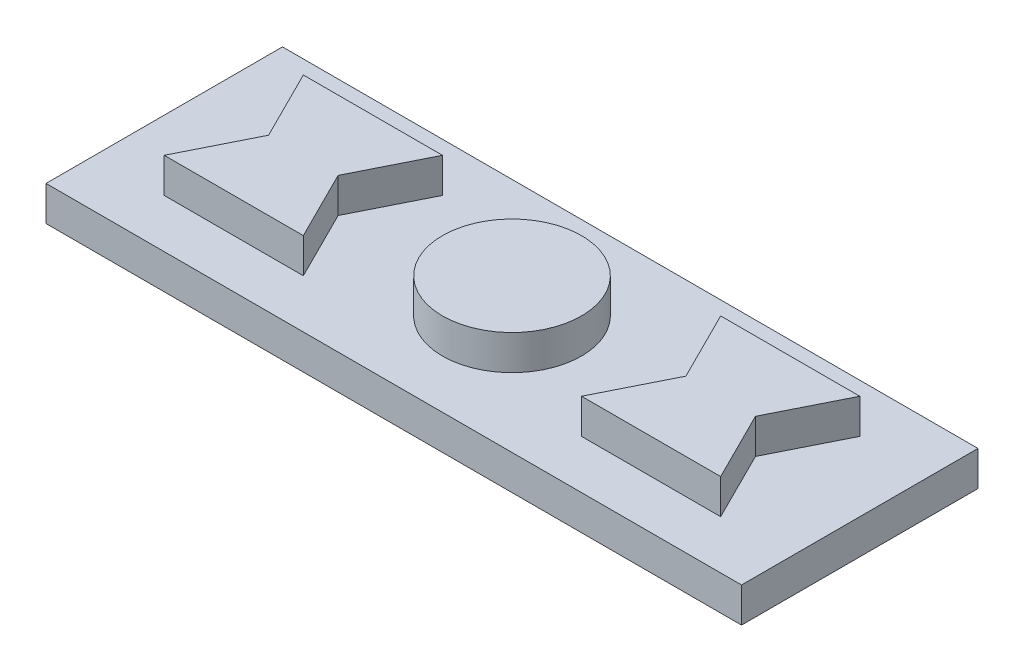
ISO-10303-21;
HEADER;
FILE_DESCRIPTION(('STEP AP214'),'2;1');
FILE_NAME('part.step','',(''),(''),'','','');
FILE_SCHEMA(('AUTOMOTIVE_DESIGN { 1 0 10303 214 1 1 1 1 }'));
ENDSEC;
DATA;
#1=APPLICATION_CONTEXT('core data for automotive mechanical design processes');
#2=APPLICATION_PROTOCOL_DEFINITION('international standard','automotive_design',2000,#1);
#3=PRODUCT_CONTEXT('',#1,'mechanical');
#4=PRODUCT('Part','Part','',(#3));
#5=PRODUCT_RELATED_PRODUCT_CATEGORY('part','',(#4));
#6=PRODUCT_DEFINITION_FORMATION('','',#4);
#7=PRODUCT_DEFINITION_CONTEXT('part definition',#1,'design');
#8=PRODUCT_DEFINITION('design','',#6,#7);
#9=PRODUCT_DEFINITION_SHAPE('','',#8);
#10=(LENGTH_UNIT() NAMED_UNIT(*) SI_UNIT(.MILLI.,.METRE.));
#11=(NAMED_UNIT(*) PLANE_ANGLE_UNIT() SI_UNIT($,.RADIAN.));
#12=(NAMED_UNIT(*) SI_UNIT($,.STERADIAN.) SOLID_ANGLE_UNIT());
#13=UNCERTAINTY_MEASURE_WITH_UNIT(LENGTH_MEASURE(1.E-05),#10,'distance_accuracy_value','');
#14=(GEOMETRIC_REPRESENTATION_CONTEXT(3) GLOBAL_UNCERTAINTY_ASSIGNED_CONTEXT((#13)) GLOBAL_UNIT_ASSIGNED_CONTEXT((#10,
#11,#12)) REPRESENTATION_CONTEXT('',''));
#15=CARTESIAN_POINT('',(0.,0.,0.));
#16=DIRECTION('',(0.,0.,1.));
#17=DIRECTION('',(1.,0.,0.));
#18=AXIS2_PLACEMENT_3D('',#15,#16,#17);
#19=CARTESIAN_POINT('',(0.,5.,0.));
#20=DIRECTION('',(0.,1.,0.));
#21=DIRECTION('',(0.,0.,1.));
#22=AXIS2_PLACEMENT_3D('',#19,#20,#21);
#23=PLANE('',#22);
#24=DIRECTION('',(0.,0.,-1.));
#25=VECTOR('',#24,1.);
#26=CARTESIAN_POINT('',(50.,5.,-17.));
#27=LINE('',#26,#25);
#28=CARTESIAN_POINT('',(50.,5.,17.));
#29=VERTEX_POINT('',#28);
#30=CARTESIAN_POINT('',(50.,5.,-17.));
#31=VERTEX_POINT('',#30);
#32=EDGE_CURVE('E308',#29,#31,#27,.T.);
#33=ORIENTED_EDGE('',*,*,#32,.T.);
#34=DIRECTION('',(-1.,0.,0.));
#35=VECTOR('',#34,1.);
#36=CARTESIAN_POINT('',(-50.,5.,-17.));
#37=LINE('',#36,#35);
#38=CARTESIAN_POINT('',(-50.,5.,-17.));
#39=VERTEX_POINT('',#38);
#40=EDGE_CURVE('E312',#31,#39,#37,.T.);
#41=ORIENTED_EDGE('',*,*,#40,.T.);
#42=DIRECTION('',(0.,0.,1.));
#43=VECTOR('',#42,1.);
#44=CARTESIAN_POINT('',(-50.,5.,-17.));
#45=LINE('',#44,#43);
#46=CARTESIAN_POINT('',(-50.,5.,17.));
#47=VERTEX_POINT('',#46);
#48=EDGE_CURVE('E316',#39,#47,#45,.T.);
#49=ORIENTED_EDGE('',*,*,#48,.T.);
#50=DIRECTION('',(1.,0.,0.));
#51=VECTOR('',#50,1.);
#52=CARTESIAN_POINT('',(-50.,5.,17.));
#53=LINE('',#52,#51);
#54=EDGE_CURVE('E319',#47,#29,#53,.T.);
#55=ORIENTED_EDGE('',*,*,#54,.T.);
#56=EDGE_LOOP('',(#33,#41,#49,#55));
#57=FACE_BOUND('',#56,.T.);
#58=CARTESIAN_POINT('',(0.,5.,0.));
#59=DIRECTION('',(0.,1.,0.));
#60=DIRECTION('',(0.,0.,1.));
#61=AXIS2_PLACEMENT_3D('',#58,#59,#60);
#62=CIRCLE('',#61,10.);
#63=CARTESIAN_POINT('',(0.,5.,10.));
#64=VERTEX_POINT('',#63);
#65=EDGE_CURVE('E303',#64,#64,#62,.T.);
#66=ORIENTED_EDGE('',*,*,#65,.F.);
#67=EDGE_LOOP('',(#66));
#68=FACE_BOUND('',#67,.T.);
#69=DIRECTION('',(-0.447213595499956,0.,0.894427190999917));
#70=VECTOR('',#69,1.);
#71=CARTESIAN_POINT('',(-40.,5.,10.));
#72=LINE('',#71,#70);
#73=CARTESIAN_POINT('',(-35.,5.,0.));
#74=VERTEX_POINT('',#73);
#75=CARTESIAN_POINT('',(-40.,5.,10.));
#76=VERTEX_POINT('',#75);
#77=EDGE_CURVE('E286',#74,#76,#72,.T.);
#78=ORIENTED_EDGE('',*,*,#77,.F.);
#79=DIRECTION('',(0.447213595499958,0.,0.894427190999916));
#80=VECTOR('',#79,1.);
#81=CARTESIAN_POINT('',(-40.,5.,-9.99999999999999));
#82=LINE('',#81,#80);
#83=CARTESIAN_POINT('',(-40.,5.,-9.99999999999999));
#84=VERTEX_POINT('',#83);
#85=EDGE_CURVE('E282',#84,#74,#82,.T.);
#86=ORIENTED_EDGE('',*,*,#85,.F.);
#87=DIRECTION('',(-1.,0.,0.));
#88=VECTOR('',#87,1.);
#89=CARTESIAN_POINT('',(-40.,5.,-9.99999999999999));
#90=LINE('',#89,#88);
#91=CARTESIAN_POINT('',(-20.,5.,-10.));
#92=VERTEX_POINT('',#91);
#93=EDGE_CURVE('E67',#92,#84,#90,.T.);
#94=ORIENTED_EDGE('',*,*,#93,.F.);
#95=DIRECTION('',(0.447213595499958,0.,-0.894427190999916));
#96=VECTOR('',#95,1.);
#97=CARTESIAN_POINT('',(-20.,5.,-10.));
#98=LINE('',#97,#96);
#99=CARTESIAN_POINT('',(-25.,5.,0.));
#100=VERTEX_POINT('',#99);
#101=EDGE_CURVE('E298',#100,#92,#98,.T.);
#102=ORIENTED_EDGE('',*,*,#101,.F.);
#103=DIRECTION('',(-0.447213595499959,0.,-0.894427190999915));
#104=VECTOR('',#103,1.);
#105=CARTESIAN_POINT('',(-20.,5.,10.));
#106=LINE('',#105,#104);
#107=CARTESIAN_POINT('',(-20.,5.,10.));
#108=VERTEX_POINT('',#107);
#109=EDGE_CURVE('E294',#108,#100,#106,.T.);
#110=ORIENTED_EDGE('',*,*,#109,.F.);
#111=DIRECTION('',(1.,0.,0.));
#112=VECTOR('',#111,1.);
#113=CARTESIAN_POINT('',(-40.,5.,10.));
#114=LINE('',#113,#112);
#115=EDGE_CURVE('E290',#76,#108,#114,.T.);
#116=ORIENTED_EDGE('',*,*,#115,.F.);
#117=EDGE_LOOP('',(#78,#86,#94,#102,#110,#116));
#118=FACE_BOUND('',#117,.T.);
#119=DIRECTION('',(-1.,0.,0.));
#120=VECTOR('',#119,1.);
#121=CARTESIAN_POINT('',(40.,5.,-10.));
#122=LINE('',#121,#120);
#123=CARTESIAN_POINT('',(40.,5.,-10.));
#124=VERTEX_POINT('',#123);
#125=CARTESIAN_POINT('',(20.,5.,-10.));
#126=VERTEX_POINT('',#125);
#127=EDGE_CURVE('E266',#124,#126,#122,.T.);
#128=ORIENTED_EDGE('',*,*,#127,.F.);
#129=DIRECTION('',(0.447213595499957,0.,-0.894427190999916));
#130=VECTOR('',#129,1.);
#131=CARTESIAN_POINT('',(40.,5.,-10.));
#132=LINE('',#131,#130);
#133=CARTESIAN_POINT('',(35.,5.,0.));
#134=VERTEX_POINT('',#133);
#135=EDGE_CURVE('E262',#134,#124,#132,.T.);
#136=ORIENTED_EDGE('',*,*,#135,.F.);
#137=DIRECTION('',(-0.447213595499957,0.,-0.894427190999916));
#138=VECTOR('',#137,1.);
#139=CARTESIAN_POINT('',(40.,5.,9.99999999999998));
#140=LINE('',#139,#138);
#141=CARTESIAN_POINT('',(40.,5.,9.99999999999997));
#142=VERTEX_POINT('',#141);
#143=EDGE_CURVE('E59',#142,#134,#140,.T.);
#144=ORIENTED_EDGE('',*,*,#143,.F.);
#145=DIRECTION('',(1.,0.,0.));
#146=VECTOR('',#145,1.);
#147=CARTESIAN_POINT('',(40.,5.,9.99999999999998));
#148=LINE('',#147,#146);
#149=CARTESIAN_POINT('',(20.,5.,9.99999999999999));
#150=VERTEX_POINT('',#149);
#151=EDGE_CURVE('E164',#150,#142,#148,.T.);
#152=ORIENTED_EDGE('',*,*,#151,.F.);
#153=DIRECTION('',(-0.447213595499958,0.,0.894427190999916));
#154=VECTOR('',#153,1.);
#155=CARTESIAN_POINT('',(20.,5.,9.99999999999999));
#156=LINE('',#155,#154);
#157=CARTESIAN_POINT('',(25.,5.,0.));
#158=VERTEX_POINT('',#157);
#159=EDGE_CURVE('E274',#158,#150,#156,.T.);
#160=ORIENTED_EDGE('',*,*,#159,.F.);
#161=DIRECTION('',(0.447213595499959,0.,0.894427190999916));
#162=VECTOR('',#161,1.);
#163=CARTESIAN_POINT('',(20.,5.,-10.));
#164=LINE('',#163,#162);
#165=EDGE_CURVE('E270',#126,#158,#164,.T.);
#166=ORIENTED_EDGE('',*,*,#165,.F.);
#167=EDGE_LOOP('',(#128,#136,#144,#152,#160,#166));
#168=FACE_BOUND('',#167,.T.);
#169=ADVANCED_FACE('F43',(#57,#68,#118,#168),#23,.T.);
#170=CARTESIAN_POINT('',(0.,0.,0.));
#171=DIRECTION('',(0.,1.,0.));
#172=DIRECTION('',(0.,0.,1.));
#173=AXIS2_PLACEMENT_3D('',#170,#171,#172);
#174=PLANE('',#173);
#175=DIRECTION('',(0.,0.,-1.));
#176=VECTOR('',#175,1.);
#177=CARTESIAN_POINT('',(50.,0.,-17.));
#178=LINE('',#177,#176);
#179=CARTESIAN_POINT('',(50.,0.,17.));
#180=VERTEX_POINT('',#179);
#181=CARTESIAN_POINT('',(50.,0.,-17.));
#182=VERTEX_POINT('',#181);
#183=EDGE_CURVE('E307',#180,#182,#178,.T.);
#184=ORIENTED_EDGE('',*,*,#183,.F.);
#185=DIRECTION('',(1.,0.,0.));
#186=VECTOR('',#185,1.);
#187=CARTESIAN_POINT('',(-50.,0.,17.));
#188=LINE('',#187,#186);
#189=CARTESIAN_POINT('',(-50.,0.,17.));
#190=VERTEX_POINT('',#189);
#191=EDGE_CURVE('E313',#190,#180,#188,.T.);
#192=ORIENTED_EDGE('',*,*,#191,.F.);
#193=DIRECTION('',(0.,0.,1.));
#194=VECTOR('',#193,1.);
#195=CARTESIAN_POINT('',(-50.,0.,-17.));
#196=LINE('',#195,#194);
#197=CARTESIAN_POINT('',(-50.,0.,-17.));
#198=VERTEX_POINT('',#197);
#199=EDGE_CURVE('E329',#198,#190,#196,.T.);
#200=ORIENTED_EDGE('',*,*,#199,.F.);
#201=DIRECTION('',(-1.,0.,0.));
#202=VECTOR('',#201,1.);
#203=CARTESIAN_POINT('',(-50.,0.,-17.));
#204=LINE('',#203,#202);
#205=EDGE_CURVE('E326',#182,#198,#204,.T.);
#206=ORIENTED_EDGE('',*,*,#205,.F.);
#207=EDGE_LOOP('',(#184,#192,#200,#206));
#208=FACE_BOUND('',#207,.T.);
#209=ADVANCED_FACE('F352',(#208),#174,.F.);
#210=CARTESIAN_POINT('',(50.,5.,-17.));
#211=DIRECTION('',(-1.,0.,0.));
#212=DIRECTION('',(0.,0.,1.));
#213=AXIS2_PLACEMENT_3D('',#210,#211,#212);
#214=PLANE('',#213);
#215=ORIENTED_EDGE('',*,*,#183,.T.);
#216=DIRECTION('',(0.,-1.,0.));
#217=VECTOR('',#216,1.);
#218=CARTESIAN_POINT('',(50.,5.,-17.));
#219=LINE('',#218,#217);
#220=EDGE_CURVE('E11',#31,#182,#219,.T.);
#221=ORIENTED_EDGE('',*,*,#220,.F.);
#222=ORIENTED_EDGE('',*,*,#32,.F.);
#223=DIRECTION('',(0.,-1.,0.));
#224=VECTOR('',#223,1.);
#225=CARTESIAN_POINT('',(50.,5.,17.));
#226=LINE('',#225,#224);
#227=EDGE_CURVE('E322',#29,#180,#226,.T.);
#228=ORIENTED_EDGE('',*,*,#227,.T.);
#229=EDGE_LOOP('',(#215,#221,#222,#228));
#230=FACE_BOUND('',#229,.T.);
#231=ADVANCED_FACE('F45',(#230),#214,.F.);
#232=CARTESIAN_POINT('',(-50.,5.,-17.));
#233=DIRECTION('',(0.,0.,1.));
#234=DIRECTION('',(1.,0.,0.));
#235=AXIS2_PLACEMENT_3D('',#232,#233,#234);
#236=PLANE('',#235);
#237=ORIENTED_EDGE('',*,*,#205,.T.);
#238=DIRECTION('',(0.,-1.,0.));
#239=VECTOR('',#238,1.);
#240=CARTESIAN_POINT('',(-50.,5.,-17.));
#241=LINE('',#240,#239);
#242=EDGE_CURVE('E52',#39,#198,#241,.T.);
#243=ORIENTED_EDGE('',*,*,#242,.F.);
#244=ORIENTED_EDGE('',*,*,#40,.F.);
#245=ORIENTED_EDGE('',*,*,#220,.T.);
#246=EDGE_LOOP('',(#237,#243,#244,#245));
#247=FACE_BOUND('',#246,.T.);
#248=ADVANCED_FACE('F362',(#247),#236,.F.);
#249=CARTESIAN_POINT('',(-50.,5.,-17.));
#250=DIRECTION('',(1.,0.,0.));
#251=DIRECTION('',(0.,0.,-1.));
#252=AXIS2_PLACEMENT_3D('',#249,#250,#251);
#253=PLANE('',#252);
#254=ORIENTED_EDGE('',*,*,#199,.T.);
#255=DIRECTION('',(0.,-1.,0.));
#256=VECTOR('',#255,1.);
#257=CARTESIAN_POINT('',(-50.,5.,17.));
#258=LINE('',#257,#256);
#259=EDGE_CURVE('E337',#47,#190,#258,.T.);
#260=ORIENTED_EDGE('',*,*,#259,.F.);
#261=ORIENTED_EDGE('',*,*,#48,.F.);
#262=ORIENTED_EDGE('',*,*,#242,.T.);
#263=EDGE_LOOP('',(#254,#260,#261,#262));
#264=FACE_BOUND('',#263,.T.);
#265=ADVANCED_FACE('F346',(#264),#253,.F.);
#266=CARTESIAN_POINT('',(-50.,5.,17.));
#267=DIRECTION('',(0.,0.,-1.));
#268=DIRECTION('',(-1.,0.,0.));
#269=AXIS2_PLACEMENT_3D('',#266,#267,#268);
#270=PLANE('',#269);
#271=ORIENTED_EDGE('',*,*,#191,.T.);
#272=ORIENTED_EDGE('',*,*,#227,.F.);
#273=ORIENTED_EDGE('',*,*,#54,.F.);
#274=ORIENTED_EDGE('',*,*,#259,.T.);
#275=EDGE_LOOP('',(#271,#272,#273,#274));
#276=FACE_BOUND('',#275,.T.);
#277=ADVANCED_FACE('F355',(#276),#270,.F.);
#278=CARTESIAN_POINT('',(0.,10.,10.));
#279=DIRECTION('',(0.,0.,-1.));
#280=DIRECTION('',(-1.,0.,0.));
#281=AXIS2_PLACEMENT_3D('',#278,#279,#280);
#282=PLANE('',#281);
#283=ORIENTED_EDGE('',*,*,#115,.T.);
#284=DIRECTION('',(0.,-1.,0.));
#285=VECTOR('',#284,1.);
#286=CARTESIAN_POINT('',(-20.,10.,10.));
#287=LINE('',#286,#285);
#288=CARTESIAN_POINT('',(-20.,10.,10.));
#289=VERTEX_POINT('',#288);
#290=EDGE_CURVE('E258',#289,#108,#287,.T.);
#291=ORIENTED_EDGE('',*,*,#290,.F.);
#292=DIRECTION('',(1.,0.,0.));
#293=VECTOR('',#292,1.);
#294=CARTESIAN_POINT('',(0.,10.,10.));
#295=LINE('',#294,#293);
#296=CARTESIAN_POINT('',(-40.,10.,10.));
#297=VERTEX_POINT('',#296);
#298=EDGE_CURVE('E216',#297,#289,#295,.T.);
#299=ORIENTED_EDGE('',*,*,#298,.F.);
#300=DIRECTION('',(0.,-1.,0.));
#301=VECTOR('',#300,1.);
#302=CARTESIAN_POINT('',(-40.,10.,10.));
#303=LINE('',#302,#301);
#304=EDGE_CURVE('E238',#297,#76,#303,.T.);
#305=ORIENTED_EDGE('',*,*,#304,.T.);
#306=EDGE_LOOP('',(#283,#291,#299,#305));
#307=FACE_BOUND('',#306,.T.);
#308=ADVANCED_FACE('F376',(#307),#282,.F.);
#309=CARTESIAN_POINT('',(-20.,10.,10.));
#310=DIRECTION('',(-0.894427190999915,0.,0.447213595499959));
#311=DIRECTION('',(0.447213595499959,0.,0.894427190999915));
#312=AXIS2_PLACEMENT_3D('',#309,#310,#311);
#313=PLANE('',#312);
#314=ORIENTED_EDGE('',*,*,#109,.T.);
#315=DIRECTION('',(0.,-1.,0.));
#316=VECTOR('',#315,1.);
#317=CARTESIAN_POINT('',(-25.,10.,0.));
#318=LINE('',#317,#316);
#319=CARTESIAN_POINT('',(-25.,10.,0.));
#320=VERTEX_POINT('',#319);
#321=EDGE_CURVE('E254',#320,#100,#318,.T.);
#322=ORIENTED_EDGE('',*,*,#321,.F.);
#323=DIRECTION('',(-0.447213595499959,0.,-0.894427190999915));
#324=VECTOR('',#323,1.);
#325=CARTESIAN_POINT('',(-20.,10.,10.));
#326=LINE('',#325,#324);
#327=EDGE_CURVE('E220',#289,#320,#326,.T.);
#328=ORIENTED_EDGE('',*,*,#327,.F.);
#329=ORIENTED_EDGE('',*,*,#290,.T.);
#330=EDGE_LOOP('',(#314,#322,#328,#329));
#331=FACE_BOUND('',#330,.T.);
#332=ADVANCED_FACE('F383',(#331),#313,.F.);
#333=CARTESIAN_POINT('',(-20.,10.,-10.));
#334=DIRECTION('',(0.894427190999916,0.,0.447213595499958));
#335=DIRECTION('',(0.447213595499958,0.,-0.894427190999916));
#336=AXIS2_PLACEMENT_3D('',#333,#334,#335);
#337=PLANE('',#336);
#338=ORIENTED_EDGE('',*,*,#321,.T.);
#339=ORIENTED_EDGE('',*,*,#101,.T.);
#340=DIRECTION('',(0.,-1.,0.));
#341=VECTOR('',#340,1.);
#342=CARTESIAN_POINT('',(-20.,10.,-10.));
#343=LINE('',#342,#341);
#344=CARTESIAN_POINT('',(-20.,10.,-10.));
#345=VERTEX_POINT('',#344);
#346=EDGE_CURVE('E250',#345,#92,#343,.T.);
#347=ORIENTED_EDGE('',*,*,#346,.F.);
#348=DIRECTION('',(-0.447213595499958,0.,0.894427190999916));
#349=VECTOR('',#348,1.);
#350=CARTESIAN_POINT('',(-20.,10.,-10.));
#351=LINE('',#350,#349);
#352=EDGE_CURVE('E223',#345,#320,#351,.T.);
#353=ORIENTED_EDGE('',*,*,#352,.T.);
#354=EDGE_LOOP('',(#338,#339,#347,#353));
#355=FACE_BOUND('',#354,.T.);
#356=ADVANCED_FACE('F388',(#355),#337,.T.);
#357=CARTESIAN_POINT('',(0.,10.,-10.));
#358=DIRECTION('',(0.,0.,-1.));
#359=DIRECTION('',(-1.,0.,0.));
#360=AXIS2_PLACEMENT_3D('',#357,#358,#359);
#361=PLANE('',#360);
#362=ORIENTED_EDGE('',*,*,#346,.T.);
#363=ORIENTED_EDGE('',*,*,#93,.T.);
#364=DIRECTION('',(0.,-1.,0.));
#365=VECTOR('',#364,1.);
#366=CARTESIAN_POINT('',(-40.,10.,-9.99999999999999));
#367=LINE('',#366,#365);
#368=CARTESIAN_POINT('',(-40.,10.,-9.99999999999999));
#369=VERTEX_POINT('',#368);
#370=EDGE_CURVE('E246',#369,#84,#367,.T.);
#371=ORIENTED_EDGE('',*,*,#370,.F.);
#372=DIRECTION('',(1.,0.,0.));
#373=VECTOR('',#372,1.);
#374=CARTESIAN_POINT('',(0.,10.,-10.));
#375=LINE('',#374,#373);
#376=EDGE_CURVE('E227',#369,#345,#375,.T.);
#377=ORIENTED_EDGE('',*,*,#376,.T.);
#378=EDGE_LOOP('',(#362,#363,#371,#377));
#379=FACE_BOUND('',#378,.T.);
#380=ADVANCED_FACE('F405',(#379),#361,.T.);
#381=CARTESIAN_POINT('',(-28.,10.,14.));
#382=DIRECTION('',(0.894427190999916,0.,-0.447213595499958));
#383=DIRECTION('',(-0.447213595499958,0.,-0.894427190999916));
#384=AXIS2_PLACEMENT_3D('',#381,#382,#383);
#385=PLANE('',#384);
#386=ORIENTED_EDGE('',*,*,#85,.T.);
#387=DIRECTION('',(0.,-1.,0.));
#388=VECTOR('',#387,1.);
#389=CARTESIAN_POINT('',(-35.,10.,0.));
#390=LINE('',#389,#388);
#391=CARTESIAN_POINT('',(-35.,10.,0.));
#392=VERTEX_POINT('',#391);
#393=EDGE_CURVE('E242',#392,#74,#390,.T.);
#394=ORIENTED_EDGE('',*,*,#393,.F.);
#395=DIRECTION('',(0.447213595499958,0.,0.894427190999916));
#396=VECTOR('',#395,1.);
#397=CARTESIAN_POINT('',(-28.,10.,14.));
#398=LINE('',#397,#396);
#399=EDGE_CURVE('E231',#369,#392,#398,.T.);
#400=ORIENTED_EDGE('',*,*,#399,.F.);
#401=ORIENTED_EDGE('',*,*,#370,.T.);
#402=EDGE_LOOP('',(#386,#394,#400,#401));
#403=FACE_BOUND('',#402,.T.);
#404=ADVANCED_FACE('F403',(#403),#385,.F.);
#405=CARTESIAN_POINT('',(-28.0000000000001,10.,-14.));
#406=DIRECTION('',(-0.894427190999917,0.,-0.447213595499956));
#407=DIRECTION('',(-0.447213595499956,0.,0.894427190999917));
#408=AXIS2_PLACEMENT_3D('',#405,#406,#407);
#409=PLANE('',#408);
#410=ORIENTED_EDGE('',*,*,#393,.T.);
#411=ORIENTED_EDGE('',*,*,#77,.T.);
#412=ORIENTED_EDGE('',*,*,#304,.F.);
#413=DIRECTION('',(0.447213595499956,0.,-0.894427190999917));
#414=VECTOR('',#413,1.);
#415=CARTESIAN_POINT('',(-28.0000000000001,10.,-14.));
#416=LINE('',#415,#414);
#417=EDGE_CURVE('E234',#297,#392,#416,.T.);
#418=ORIENTED_EDGE('',*,*,#417,.T.);
#419=EDGE_LOOP('',(#410,#411,#412,#418));
#420=FACE_BOUND('',#419,.T.);
#421=ADVANCED_FACE('F401',(#420),#409,.T.);
#422=CARTESIAN_POINT('',(0.,10.,0.));
#423=DIRECTION('',(0.,1.,0.));
#424=DIRECTION('',(0.,0.,1.));
#425=AXIS2_PLACEMENT_3D('',#422,#423,#424);
#426=PLANE('',#425);
#427=ORIENTED_EDGE('',*,*,#298,.T.);
#428=ORIENTED_EDGE('',*,*,#327,.T.);
#429=ORIENTED_EDGE('',*,*,#352,.F.);
#430=ORIENTED_EDGE('',*,*,#376,.F.);
#431=ORIENTED_EDGE('',*,*,#399,.T.);
#432=ORIENTED_EDGE('',*,*,#417,.F.);
#433=EDGE_LOOP('',(#427,#428,#429,#430,#431,#432));
#434=FACE_BOUND('',#433,.T.);
#435=ADVANCED_FACE('F396',(#434),#426,.T.);
#436=CARTESIAN_POINT('',(0.,10.,0.));
#437=DIRECTION('',(0.,-1.,0.));
#438=DIRECTION('',(0.,0.,-1.));
#439=AXIS2_PLACEMENT_3D('',#436,#437,#438);
#440=CYLINDRICAL_SURFACE('',#439,10.);
#441=ORIENTED_EDGE('',*,*,#65,.T.);
#442=EDGE_LOOP('',(#441));
#443=FACE_BOUND('',#442,.T.);
#444=CARTESIAN_POINT('',(0.,10.,0.));
#445=DIRECTION('',(0.,1.,0.));
#446=DIRECTION('',(0.,0.,1.));
#447=AXIS2_PLACEMENT_3D('',#444,#445,#446);
#448=CIRCLE('',#447,10.);
#449=CARTESIAN_POINT('',(0.,10.,10.));
#450=VERTEX_POINT('',#449);
#451=EDGE_CURVE('E167',#450,#450,#448,.T.);
#452=ORIENTED_EDGE('',*,*,#451,.F.);
#453=EDGE_LOOP('',(#452));
#454=FACE_BOUND('',#453,.T.);
#455=ADVANCED_FACE('F420',(#443,#454),#440,.T.);
#456=CARTESIAN_POINT('',(0.,10.,0.));
#457=DIRECTION('',(0.,1.,0.));
#458=DIRECTION('',(0.,0.,1.));
#459=AXIS2_PLACEMENT_3D('',#456,#457,#458);
#460=PLANE('',#459);
#461=ORIENTED_EDGE('',*,*,#451,.T.);
#462=EDGE_LOOP('',(#461));
#463=FACE_BOUND('',#462,.T.);
#464=ADVANCED_FACE('F423',(#463),#460,.T.);
#465=CARTESIAN_POINT('',(0.,10.,10.));
#466=DIRECTION('',(0.,0.,1.));
#467=DIRECTION('',(1.,0.,0.));
#468=AXIS2_PLACEMENT_3D('',#465,#466,#467);
#469=PLANE('',#468);
#470=DIRECTION('',(0.,-1.,0.));
#471=VECTOR('',#470,1.);
#472=CARTESIAN_POINT('',(20.,10.,9.99999999999999));
#473=LINE('',#472,#471);
#474=CARTESIAN_POINT('',(20.,10.,9.99999999999999));
#475=VERTEX_POINT('',#474);
#476=EDGE_CURVE('E196',#475,#150,#473,.T.);
#477=ORIENTED_EDGE('',*,*,#476,.T.);
#478=ORIENTED_EDGE('',*,*,#151,.T.);
#479=DIRECTION('',(0.,-1.,0.));
#480=VECTOR('',#479,1.);
#481=CARTESIAN_POINT('',(40.,10.,9.99999999999998));
#482=LINE('',#481,#480);
#483=CARTESIAN_POINT('',(40.,10.,9.99999999999998));
#484=VERTEX_POINT('',#483);
#485=EDGE_CURVE('E157',#484,#142,#482,.T.);
#486=ORIENTED_EDGE('',*,*,#485,.F.);
#487=DIRECTION('',(-1.,0.,0.));
#488=VECTOR('',#487,1.);
#489=CARTESIAN_POINT('',(0.,10.,10.));
#490=LINE('',#489,#488);
#491=EDGE_CURVE('E162',#484,#475,#490,.T.);
#492=ORIENTED_EDGE('',*,*,#491,.T.);
#493=EDGE_LOOP('',(#477,#478,#486,#492));
#494=FACE_BOUND('',#493,.T.);
#495=ADVANCED_FACE('F160',(#494),#469,.T.);
#496=CARTESIAN_POINT('',(28.,10.,-14.));
#497=DIRECTION('',(-0.894427190999916,0.,0.447213595499957));
#498=DIRECTION('',(0.447213595499957,0.,0.894427190999916));
#499=AXIS2_PLACEMENT_3D('',#496,#497,#498);
#500=PLANE('',#499);
#501=ORIENTED_EDGE('',*,*,#143,.T.);
#502=DIRECTION('',(0.,-1.,0.));
#503=VECTOR('',#502,1.);
#504=CARTESIAN_POINT('',(35.,10.,0.));
#505=LINE('',#504,#503);
#506=CARTESIAN_POINT('',(35.,10.,0.));
#507=VERTEX_POINT('',#506);
#508=EDGE_CURVE('E168',#507,#134,#505,.T.);
#509=ORIENTED_EDGE('',*,*,#508,.F.);
#510=DIRECTION('',(-0.447213595499957,0.,-0.894427190999916));
#511=VECTOR('',#510,1.);
#512=CARTESIAN_POINT('',(28.,10.,-14.));
#513=LINE('',#512,#511);
#514=EDGE_CURVE('E171',#484,#507,#513,.T.);
#515=ORIENTED_EDGE('',*,*,#514,.F.);
#516=ORIENTED_EDGE('',*,*,#485,.T.);
#517=EDGE_LOOP('',(#501,#509,#515,#516));
#518=FACE_BOUND('',#517,.T.);
#519=ADVANCED_FACE('F172',(#518),#500,.F.);
#520=CARTESIAN_POINT('',(28.,10.,14.));
#521=DIRECTION('',(0.894427190999916,0.,0.447213595499957));
#522=DIRECTION('',(0.447213595499957,0.,-0.894427190999916));
#523=AXIS2_PLACEMENT_3D('',#520,#521,#522);
#524=PLANE('',#523);
#525=ORIENTED_EDGE('',*,*,#508,.T.);
#526=ORIENTED_EDGE('',*,*,#135,.T.);
#527=DIRECTION('',(0.,-1.,0.));
#528=VECTOR('',#527,1.);
#529=CARTESIAN_POINT('',(40.,10.,-10.));
#530=LINE('',#529,#528);
#531=CARTESIAN_POINT('',(40.,10.,-10.));
#532=VERTEX_POINT('',#531);
#533=EDGE_CURVE('E207',#532,#124,#530,.T.);
#534=ORIENTED_EDGE('',*,*,#533,.F.);
#535=DIRECTION('',(-0.447213595499957,0.,0.894427190999916));
#536=VECTOR('',#535,1.);
#537=CARTESIAN_POINT('',(28.,10.,14.));
#538=LINE('',#537,#536);
#539=EDGE_CURVE('E178',#532,#507,#538,.T.);
#540=ORIENTED_EDGE('',*,*,#539,.T.);
#541=EDGE_LOOP('',(#525,#526,#534,#540));
#542=FACE_BOUND('',#541,.T.);
#543=ADVANCED_FACE('F432',(#542),#524,.T.);
#544=CARTESIAN_POINT('',(0.,10.,-10.));
#545=DIRECTION('',(0.,0.,1.));
#546=DIRECTION('',(1.,0.,0.));
#547=AXIS2_PLACEMENT_3D('',#544,#545,#546);
#548=PLANE('',#547);
#549=ORIENTED_EDGE('',*,*,#127,.T.);
#550=DIRECTION('',(0.,-1.,0.));
#551=VECTOR('',#550,1.);
#552=CARTESIAN_POINT('',(20.,10.,-10.));
#553=LINE('',#552,#551);
#554=CARTESIAN_POINT('',(20.,10.,-10.));
#555=VERTEX_POINT('',#554);
#556=EDGE_CURVE('E203',#555,#126,#553,.T.);
#557=ORIENTED_EDGE('',*,*,#556,.F.);
#558=DIRECTION('',(-1.,0.,0.));
#559=VECTOR('',#558,1.);
#560=CARTESIAN_POINT('',(0.,10.,-10.));
#561=LINE('',#560,#559);
#562=EDGE_CURVE('E188',#532,#555,#561,.T.);
#563=ORIENTED_EDGE('',*,*,#562,.F.);
#564=ORIENTED_EDGE('',*,*,#533,.T.);
#565=EDGE_LOOP('',(#549,#557,#563,#564));
#566=FACE_BOUND('',#565,.T.);
#567=ADVANCED_FACE('F435',(#566),#548,.F.);
#568=CARTESIAN_POINT('',(20.,10.,-10.));
#569=DIRECTION('',(0.894427190999915,0.,-0.447213595499959));
#570=DIRECTION('',(-0.447213595499959,0.,-0.894427190999915));
#571=AXIS2_PLACEMENT_3D('',#568,#569,#570);
#572=PLANE('',#571);
#573=ORIENTED_EDGE('',*,*,#165,.T.);
#574=DIRECTION('',(0.,-1.,0.));
#575=VECTOR('',#574,1.);
#576=CARTESIAN_POINT('',(25.,10.,0.));
#577=LINE('',#576,#575);
#578=CARTESIAN_POINT('',(25.,10.,0.));
#579=VERTEX_POINT('',#578);
#580=EDGE_CURVE('E199',#579,#158,#577,.T.);
#581=ORIENTED_EDGE('',*,*,#580,.F.);
#582=DIRECTION('',(0.447213595499959,0.,0.894427190999915));
#583=VECTOR('',#582,1.);
#584=CARTESIAN_POINT('',(20.,10.,-10.));
#585=LINE('',#584,#583);
#586=EDGE_CURVE('E191',#555,#579,#585,.T.);
#587=ORIENTED_EDGE('',*,*,#586,.F.);
#588=ORIENTED_EDGE('',*,*,#556,.T.);
#589=EDGE_LOOP('',(#573,#581,#587,#588));
#590=FACE_BOUND('',#589,.T.);
#591=ADVANCED_FACE('F439',(#590),#572,.F.);
#592=CARTESIAN_POINT('',(20.,10.,10.));
#593=DIRECTION('',(-0.894427190999916,0.,-0.447213595499958));
#594=DIRECTION('',(-0.447213595499958,0.,0.894427190999916));
#595=AXIS2_PLACEMENT_3D('',#592,#593,#594);
#596=PLANE('',#595);
#597=ORIENTED_EDGE('',*,*,#580,.T.);
#598=ORIENTED_EDGE('',*,*,#159,.T.);
#599=ORIENTED_EDGE('',*,*,#476,.F.);
#600=DIRECTION('',(0.447213595499958,0.,-0.894427190999916));
#601=VECTOR('',#600,1.);
#602=CARTESIAN_POINT('',(20.,10.,10.));
#603=LINE('',#602,#601);
#604=EDGE_CURVE('E182',#475,#579,#603,.T.);
#605=ORIENTED_EDGE('',*,*,#604,.T.);
#606=EDGE_LOOP('',(#597,#598,#599,#605));
#607=FACE_BOUND('',#606,.T.);
#608=ADVANCED_FACE('F443',(#607),#596,.T.);
#609=CARTESIAN_POINT('',(0.,10.,0.));
#610=DIRECTION('',(0.,1.,0.));
#611=DIRECTION('',(0.,0.,1.));
#612=AXIS2_PLACEMENT_3D('',#609,#610,#611);
#613=PLANE('',#612);
#614=ORIENTED_EDGE('',*,*,#491,.F.);
#615=ORIENTED_EDGE('',*,*,#514,.T.);
#616=ORIENTED_EDGE('',*,*,#539,.F.);
#617=ORIENTED_EDGE('',*,*,#562,.T.);
#618=ORIENTED_EDGE('',*,*,#586,.T.);
#619=ORIENTED_EDGE('',*,*,#604,.F.);
#620=EDGE_LOOP('',(#614,#615,#616,#617,#618,#619));
#621=FACE_BOUND('',#620,.T.);
#622=ADVANCED_FACE('F180',(#621),#613,.T.);
#623=CLOSED_SHELL('',(#169,#209,#231,#248,#265,#277,#308,#332,#356,#380,#404,#421,#435,#455,
#464,#495,#519,#543,#567,#591,#608,#622));
#624=MANIFOLD_SOLID_BREP('B2',#623);
#625=ADVANCED_BREP_SHAPE_REPRESENTATION('',(#18,#624),#14);
#626=SHAPE_DEFINITION_REPRESENTATION(#9,#625);
ENDSEC;
END-ISO-10303-21;
